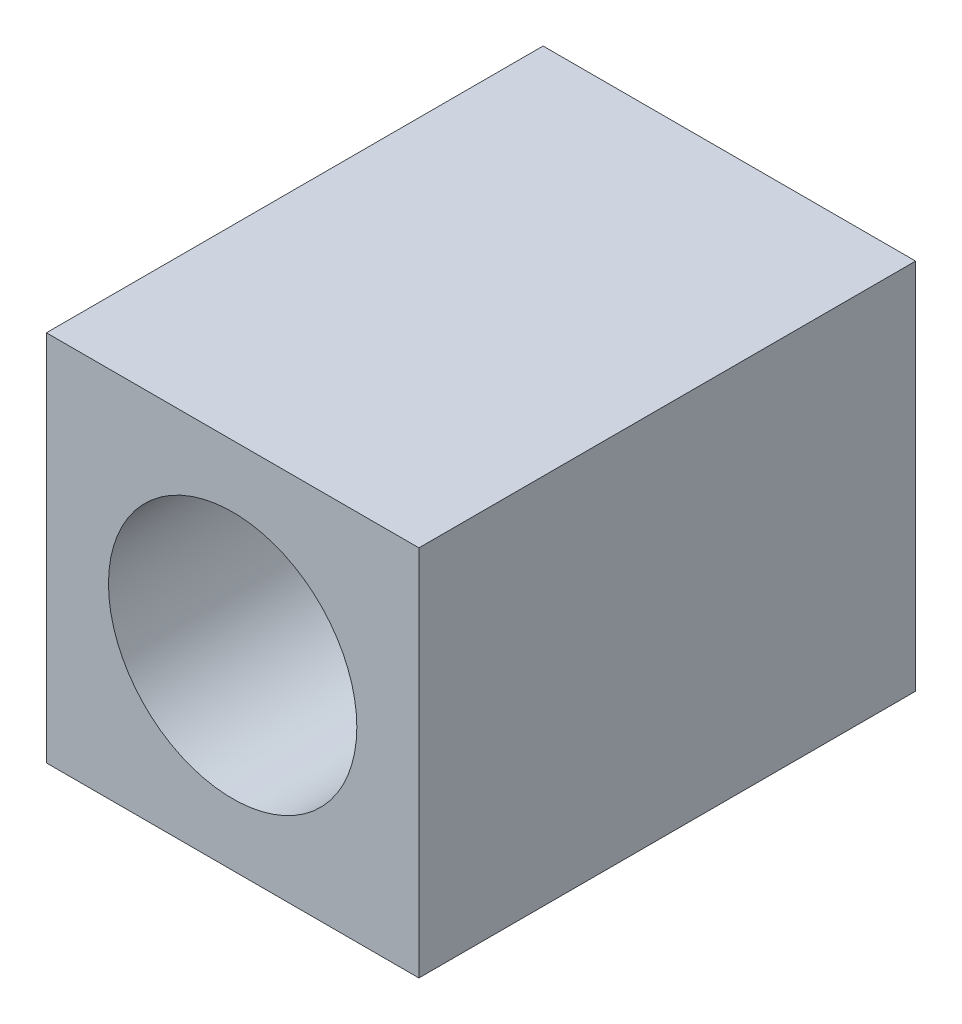
ISO-10303-21;
HEADER;
FILE_DESCRIPTION(('STEP AP214'),'2;1');
FILE_NAME('part.step','',(''),(''),'','','');
FILE_SCHEMA(('AUTOMOTIVE_DESIGN { 1 0 10303 214 1 1 1 1 }'));
ENDSEC;
DATA;
#1=APPLICATION_CONTEXT('core data for automotive mechanical design processes');
#2=APPLICATION_PROTOCOL_DEFINITION('international standard','automotive_design',2000,#1);
#3=PRODUCT_CONTEXT('',#1,'mechanical');
#4=PRODUCT('Part','Part','',(#3));
#5=PRODUCT_RELATED_PRODUCT_CATEGORY('part','',(#4));
#6=PRODUCT_DEFINITION_FORMATION('','',#4);
#7=PRODUCT_DEFINITION_CONTEXT('part definition',#1,'design');
#8=PRODUCT_DEFINITION('design','',#6,#7);
#9=PRODUCT_DEFINITION_SHAPE('','',#8);
#10=(LENGTH_UNIT() NAMED_UNIT(*) SI_UNIT(.MILLI.,.METRE.));
#11=(NAMED_UNIT(*) PLANE_ANGLE_UNIT() SI_UNIT($,.RADIAN.));
#12=(NAMED_UNIT(*) SI_UNIT($,.STERADIAN.) SOLID_ANGLE_UNIT());
#13=UNCERTAINTY_MEASURE_WITH_UNIT(LENGTH_MEASURE(1.E-05),#10,'distance_accuracy_value','');
#14=(GEOMETRIC_REPRESENTATION_CONTEXT(3) GLOBAL_UNCERTAINTY_ASSIGNED_CONTEXT((#13)) GLOBAL_UNIT_ASSIGNED_CONTEXT((#10,
#11,#12)) REPRESENTATION_CONTEXT('',''));
#15=CARTESIAN_POINT('',(0.,0.,0.));
#16=DIRECTION('',(0.,0.,1.));
#17=DIRECTION('',(1.,0.,0.));
#18=AXIS2_PLACEMENT_3D('',#15,#16,#17);
#19=CARTESIAN_POINT('',(3.,-3.,8.));
#20=DIRECTION('',(-1.,0.,0.));
#21=DIRECTION('',(0.,0.,1.));
#22=AXIS2_PLACEMENT_3D('',#19,#20,#21);
#23=PLANE('',#22);
#24=DIRECTION('',(0.,1.,0.));
#25=VECTOR('',#24,1.);
#26=CARTESIAN_POINT('',(3.,-3.,0.));
#27=LINE('',#26,#25);
#28=CARTESIAN_POINT('',(3.,-3.,0.));
#29=VERTEX_POINT('',#28);
#30=CARTESIAN_POINT('',(3.,3.,0.));
#31=VERTEX_POINT('',#30);
#32=EDGE_CURVE('E107',#29,#31,#27,.T.);
#33=ORIENTED_EDGE('',*,*,#32,.T.);
#34=DIRECTION('',(0.,0.,-1.));
#35=VECTOR('',#34,1.);
#36=CARTESIAN_POINT('',(3.,3.,8.));
#37=LINE('',#36,#35);
#38=CARTESIAN_POINT('',(3.,3.,8.));
#39=VERTEX_POINT('',#38);
#40=EDGE_CURVE('E11',#39,#31,#37,.T.);
#41=ORIENTED_EDGE('',*,*,#40,.F.);
#42=DIRECTION('',(0.,1.,0.));
#43=VECTOR('',#42,1.);
#44=CARTESIAN_POINT('',(3.,-3.,8.));
#45=LINE('',#44,#43);
#46=CARTESIAN_POINT('',(3.,-3.,8.));
#47=VERTEX_POINT('',#46);
#48=EDGE_CURVE('E91',#47,#39,#45,.T.);
#49=ORIENTED_EDGE('',*,*,#48,.F.);
#50=DIRECTION('',(0.,0.,-1.));
#51=VECTOR('',#50,1.);
#52=CARTESIAN_POINT('',(3.,-3.,8.));
#53=LINE('',#52,#51);
#54=EDGE_CURVE('E103',#47,#29,#53,.T.);
#55=ORIENTED_EDGE('',*,*,#54,.T.);
#56=EDGE_LOOP('',(#33,#41,#49,#55));
#57=FACE_BOUND('',#56,.T.);
#58=ADVANCED_FACE('F39',(#57),#23,.F.);
#59=CARTESIAN_POINT('',(-3.,3.,8.));
#60=DIRECTION('',(0.,-1.,0.));
#61=DIRECTION('',(0.,0.,-1.));
#62=AXIS2_PLACEMENT_3D('',#59,#60,#61);
#63=PLANE('',#62);
#64=DIRECTION('',(-1.,0.,0.));
#65=VECTOR('',#64,1.);
#66=CARTESIAN_POINT('',(-3.,3.,0.));
#67=LINE('',#66,#65);
#68=CARTESIAN_POINT('',(-3.,3.,0.));
#69=VERTEX_POINT('',#68);
#70=EDGE_CURVE('E96',#31,#69,#67,.T.);
#71=ORIENTED_EDGE('',*,*,#70,.T.);
#72=DIRECTION('',(0.,0.,-1.));
#73=VECTOR('',#72,1.);
#74=CARTESIAN_POINT('',(-3.,3.,8.));
#75=LINE('',#74,#73);
#76=CARTESIAN_POINT('',(-3.,3.,8.));
#77=VERTEX_POINT('',#76);
#78=EDGE_CURVE('E48',#77,#69,#75,.T.);
#79=ORIENTED_EDGE('',*,*,#78,.F.);
#80=DIRECTION('',(-1.,0.,0.));
#81=VECTOR('',#80,1.);
#82=CARTESIAN_POINT('',(-3.,3.,8.));
#83=LINE('',#82,#81);
#84=EDGE_CURVE('E86',#39,#77,#83,.T.);
#85=ORIENTED_EDGE('',*,*,#84,.F.);
#86=ORIENTED_EDGE('',*,*,#40,.T.);
#87=EDGE_LOOP('',(#71,#79,#85,#86));
#88=FACE_BOUND('',#87,.T.);
#89=ADVANCED_FACE('F95',(#88),#63,.F.);
#90=CARTESIAN_POINT('',(-3.,-3.,8.));
#91=DIRECTION('',(1.,0.,0.));
#92=DIRECTION('',(0.,0.,-1.));
#93=AXIS2_PLACEMENT_3D('',#90,#91,#92);
#94=PLANE('',#93);
#95=DIRECTION('',(0.,-1.,0.));
#96=VECTOR('',#95,1.);
#97=CARTESIAN_POINT('',(-3.,-3.,0.));
#98=LINE('',#97,#96);
#99=CARTESIAN_POINT('',(-3.,-3.,0.));
#100=VERTEX_POINT('',#99);
#101=EDGE_CURVE('E73',#69,#100,#98,.T.);
#102=ORIENTED_EDGE('',*,*,#101,.T.);
#103=DIRECTION('',(0.,0.,-1.));
#104=VECTOR('',#103,1.);
#105=CARTESIAN_POINT('',(-3.,-3.,8.));
#106=LINE('',#105,#104);
#107=CARTESIAN_POINT('',(-3.,-3.,8.));
#108=VERTEX_POINT('',#107);
#109=EDGE_CURVE('E98',#108,#100,#106,.T.);
#110=ORIENTED_EDGE('',*,*,#109,.F.);
#111=DIRECTION('',(0.,-1.,0.));
#112=VECTOR('',#111,1.);
#113=CARTESIAN_POINT('',(-3.,-3.,8.));
#114=LINE('',#113,#112);
#115=EDGE_CURVE('E89',#77,#108,#114,.T.);
#116=ORIENTED_EDGE('',*,*,#115,.F.);
#117=ORIENTED_EDGE('',*,*,#78,.T.);
#118=EDGE_LOOP('',(#102,#110,#116,#117));
#119=FACE_BOUND('',#118,.T.);
#120=ADVANCED_FACE('F99',(#119),#94,.F.);
#121=CARTESIAN_POINT('',(-3.,-3.,8.));
#122=DIRECTION('',(0.,1.,0.));
#123=DIRECTION('',(-1.,0.,0.));
#124=AXIS2_PLACEMENT_3D('',#121,#122,#123);
#125=PLANE('',#124);
#126=DIRECTION('',(1.,0.,0.));
#127=VECTOR('',#126,1.);
#128=CARTESIAN_POINT('',(-3.,-3.,0.));
#129=LINE('',#128,#127);
#130=EDGE_CURVE('E79',#100,#29,#129,.T.);
#131=ORIENTED_EDGE('',*,*,#130,.T.);
#132=ORIENTED_EDGE('',*,*,#54,.F.);
#133=DIRECTION('',(1.,0.,0.));
#134=VECTOR('',#133,1.);
#135=CARTESIAN_POINT('',(-3.,-3.,8.));
#136=LINE('',#135,#134);
#137=EDGE_CURVE('E56',#108,#47,#136,.T.);
#138=ORIENTED_EDGE('',*,*,#137,.F.);
#139=ORIENTED_EDGE('',*,*,#109,.T.);
#140=EDGE_LOOP('',(#131,#132,#138,#139));
#141=FACE_BOUND('',#140,.T.);
#142=ADVANCED_FACE('F121',(#141),#125,.F.);
#143=CARTESIAN_POINT('',(0.,0.,8.));
#144=DIRECTION('',(0.,0.,-1.));
#145=DIRECTION('',(-1.,0.,0.));
#146=AXIS2_PLACEMENT_3D('',#143,#144,#145);
#147=PLANE('',#146);
#148=CARTESIAN_POINT('',(0.,0.,8.));
#149=DIRECTION('',(0.,0.,1.));
#150=DIRECTION('',(1.,0.,0.));
#151=AXIS2_PLACEMENT_3D('',#148,#149,#150);
#152=CIRCLE('',#151,2.);
#153=CARTESIAN_POINT('',(2.,0.,8.));
#154=VERTEX_POINT('',#153);
#155=EDGE_CURVE('E128',#154,#154,#152,.T.);
#156=ORIENTED_EDGE('',*,*,#155,.F.);
#157=EDGE_LOOP('',(#156));
#158=FACE_BOUND('',#157,.T.);
#159=ORIENTED_EDGE('',*,*,#48,.T.);
#160=ORIENTED_EDGE('',*,*,#84,.T.);
#161=ORIENTED_EDGE('',*,*,#115,.T.);
#162=ORIENTED_EDGE('',*,*,#137,.T.);
#163=EDGE_LOOP('',(#159,#160,#161,#162));
#164=FACE_BOUND('',#163,.T.);
#165=ADVANCED_FACE('F87',(#158,#164),#147,.F.);
#166=CARTESIAN_POINT('',(0.,0.,0.));
#167=DIRECTION('',(0.,0.,-1.));
#168=DIRECTION('',(-1.,0.,0.));
#169=AXIS2_PLACEMENT_3D('',#166,#167,#168);
#170=PLANE('',#169);
#171=CARTESIAN_POINT('',(0.,0.,0.));
#172=DIRECTION('',(0.,0.,1.));
#173=DIRECTION('',(1.,0.,0.));
#174=AXIS2_PLACEMENT_3D('',#171,#172,#173);
#175=CIRCLE('',#174,2.);
#176=CARTESIAN_POINT('',(2.,0.,0.));
#177=VERTEX_POINT('',#176);
#178=EDGE_CURVE('E111',#177,#177,#175,.T.);
#179=ORIENTED_EDGE('',*,*,#178,.T.);
#180=EDGE_LOOP('',(#179));
#181=FACE_BOUND('',#180,.T.);
#182=ORIENTED_EDGE('',*,*,#32,.F.);
#183=ORIENTED_EDGE('',*,*,#130,.F.);
#184=ORIENTED_EDGE('',*,*,#101,.F.);
#185=ORIENTED_EDGE('',*,*,#70,.F.);
#186=EDGE_LOOP('',(#182,#183,#184,#185));
#187=FACE_BOUND('',#186,.T.);
#188=ADVANCED_FACE('F124',(#181,#187),#170,.T.);
#189=CARTESIAN_POINT('',(0.,0.,0.));
#190=DIRECTION('',(0.,0.,1.));
#191=DIRECTION('',(1.,0.,0.));
#192=AXIS2_PLACEMENT_3D('',#189,#190,#191);
#193=CYLINDRICAL_SURFACE('',#192,2.);
#194=ORIENTED_EDGE('',*,*,#178,.F.);
#195=EDGE_LOOP('',(#194));
#196=FACE_BOUND('',#195,.T.);
#197=ORIENTED_EDGE('',*,*,#155,.T.);
#198=EDGE_LOOP('',(#197));
#199=FACE_BOUND('',#198,.T.);
#200=ADVANCED_FACE('F137',(#196,#199),#193,.F.);
#201=CLOSED_SHELL('',(#58,#89,#120,#142,#165,#188,#200));
#202=MANIFOLD_SOLID_BREP('B2',#201);
#203=ADVANCED_BREP_SHAPE_REPRESENTATION('',(#18,#202),#14);
#204=SHAPE_DEFINITION_REPRESENTATION(#9,#203);
ENDSEC;
END-ISO-10303-21;
